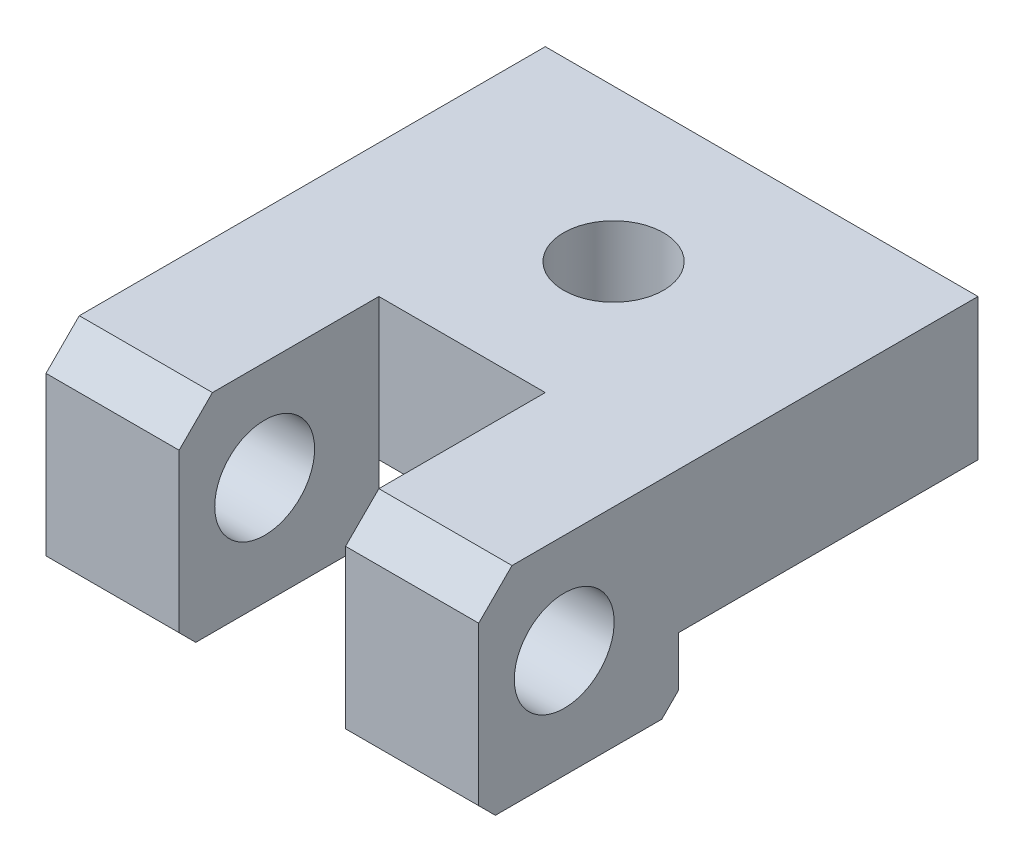
ISO-10303-21;
HEADER;
FILE_DESCRIPTION(('STEP AP214'),'2;1');
FILE_NAME('part.step','',(''),(''),'','','');
FILE_SCHEMA(('AUTOMOTIVE_DESIGN { 1 0 10303 214 1 1 1 1 }'));
ENDSEC;
DATA;
#1=APPLICATION_CONTEXT('core data for automotive mechanical design processes');
#2=APPLICATION_PROTOCOL_DEFINITION('international standard','automotive_design',2000,#1);
#3=PRODUCT_CONTEXT('',#1,'mechanical');
#4=PRODUCT('Part','Part','',(#3));
#5=PRODUCT_RELATED_PRODUCT_CATEGORY('part','',(#4));
#6=PRODUCT_DEFINITION_FORMATION('','',#4);
#7=PRODUCT_DEFINITION_CONTEXT('part definition',#1,'design');
#8=PRODUCT_DEFINITION('design','',#6,#7);
#9=PRODUCT_DEFINITION_SHAPE('','',#8);
#10=(LENGTH_UNIT() NAMED_UNIT(*) SI_UNIT(.MILLI.,.METRE.));
#11=(NAMED_UNIT(*) PLANE_ANGLE_UNIT() SI_UNIT($,.RADIAN.));
#12=(NAMED_UNIT(*) SI_UNIT($,.STERADIAN.) SOLID_ANGLE_UNIT());
#13=UNCERTAINTY_MEASURE_WITH_UNIT(LENGTH_MEASURE(1.E-05),#10,'distance_accuracy_value','');
#14=(GEOMETRIC_REPRESENTATION_CONTEXT(3) GLOBAL_UNCERTAINTY_ASSIGNED_CONTEXT((#13)) GLOBAL_UNIT_ASSIGNED_CONTEXT((#10,
#11,#12)) REPRESENTATION_CONTEXT('',''));
#15=CARTESIAN_POINT('',(0.,0.,0.));
#16=DIRECTION('',(0.,0.,1.));
#17=DIRECTION('',(1.,0.,0.));
#18=AXIS2_PLACEMENT_3D('',#15,#16,#17);
#19=CARTESIAN_POINT('',(15.,-7.5,20.));
#20=DIRECTION('',(0.,0.,1.));
#21=DIRECTION('',(1.,0.,0.));
#22=AXIS2_PLACEMENT_3D('',#19,#20,#21);
#23=PLANE('',#22);
#24=DIRECTION('',(0.,-1.,0.));
#25=VECTOR('',#24,1.);
#26=CARTESIAN_POINT('',(13.,-7.5,20.));
#27=LINE('',#26,#25);
#28=CARTESIAN_POINT('',(13.,4.,20.));
#29=VERTEX_POINT('',#28);
#30=CARTESIAN_POINT('',(13.,-5.5,20.));
#31=VERTEX_POINT('',#30);
#32=EDGE_CURVE('E166',#29,#31,#27,.T.);
#33=ORIENTED_EDGE('',*,*,#32,.F.);
#34=DIRECTION('',(-1.,0.,0.));
#35=VECTOR('',#34,1.);
#36=CARTESIAN_POINT('',(5.,4.,20.));
#37=LINE('',#36,#35);
#38=CARTESIAN_POINT('',(5.,3.99999999999999,20.));
#39=VERTEX_POINT('',#38);
#40=EDGE_CURVE('E180',#29,#39,#37,.T.);
#41=ORIENTED_EDGE('',*,*,#40,.T.);
#42=DIRECTION('',(0.,1.,0.));
#43=VECTOR('',#42,1.);
#44=CARTESIAN_POINT('',(5.,-7.5,20.));
#45=LINE('',#44,#43);
#46=CARTESIAN_POINT('',(5.,-5.5,20.));
#47=VERTEX_POINT('',#46);
#48=EDGE_CURVE('E202',#47,#39,#45,.T.);
#49=ORIENTED_EDGE('',*,*,#48,.F.);
#50=DIRECTION('',(1.,0.,0.));
#51=VECTOR('',#50,1.);
#52=CARTESIAN_POINT('',(15.,-5.5,20.));
#53=LINE('',#52,#51);
#54=EDGE_CURVE('E182',#47,#31,#53,.T.);
#55=ORIENTED_EDGE('',*,*,#54,.T.);
#56=EDGE_LOOP('',(#33,#41,#49,#55));
#57=FACE_BOUND('',#56,.T.);
#58=ADVANCED_FACE('F32',(#57),#23,.T.);
#59=CARTESIAN_POINT('',(-15.,6.,20.));
#60=DIRECTION('',(0.,-1.,0.));
#61=DIRECTION('',(0.,0.,-1.));
#62=AXIS2_PLACEMENT_3D('',#59,#60,#61);
#63=PLANE('',#62);
#64=CARTESIAN_POINT('',(0.231400022130722,6.,-0.869933178962582));
#65=DIRECTION('',(0.,1.,0.));
#66=DIRECTION('',(0.,0.,1.));
#67=AXIS2_PLACEMENT_3D('',#64,#65,#66);
#68=CIRCLE('',#67,3.00000000000002);
#69=CARTESIAN_POINT('',(0.231400022130722,6.,2.13006682103744));
#70=VERTEX_POINT('',#69);
#71=EDGE_CURVE('E237',#70,#70,#68,.T.);
#72=ORIENTED_EDGE('',*,*,#71,.F.);
#73=EDGE_LOOP('',(#72));
#74=FACE_BOUND('',#73,.T.);
#75=DIRECTION('',(1.,0.,0.));
#76=VECTOR('',#75,1.);
#77=CARTESIAN_POINT('',(15.,6.,18.));
#78=LINE('',#77,#76);
#79=CARTESIAN_POINT('',(5.,6.,18.));
#80=VERTEX_POINT('',#79);
#81=CARTESIAN_POINT('',(13.,6.,18.));
#82=VERTEX_POINT('',#81);
#83=EDGE_CURVE('E175',#80,#82,#78,.T.);
#84=ORIENTED_EDGE('',*,*,#83,.T.);
#85=DIRECTION('',(0.,0.,1.));
#86=VECTOR('',#85,1.);
#87=CARTESIAN_POINT('',(13.,6.,-13.3998616387441));
#88=LINE('',#87,#86);
#89=CARTESIAN_POINT('',(13.,6.,-10.));
#90=VERTEX_POINT('',#89);
#91=EDGE_CURVE('E286',#90,#82,#88,.T.);
#92=ORIENTED_EDGE('',*,*,#91,.F.);
#93=DIRECTION('',(1.,0.,0.));
#94=VECTOR('',#93,1.);
#95=CARTESIAN_POINT('',(-15.,6.,-10.));
#96=LINE('',#95,#94);
#97=CARTESIAN_POINT('',(-13.,6.,-10.));
#98=VERTEX_POINT('',#97);
#99=EDGE_CURVE('E212',#98,#90,#96,.T.);
#100=ORIENTED_EDGE('',*,*,#99,.F.);
#101=DIRECTION('',(0.,0.,-1.));
#102=VECTOR('',#101,1.);
#103=CARTESIAN_POINT('',(-13.,6.,-13.3998616387441));
#104=LINE('',#103,#102);
#105=CARTESIAN_POINT('',(-13.,6.,18.));
#106=VERTEX_POINT('',#105);
#107=EDGE_CURVE('E267',#106,#98,#104,.T.);
#108=ORIENTED_EDGE('',*,*,#107,.F.);
#109=DIRECTION('',(1.,0.,0.));
#110=VECTOR('',#109,1.);
#111=CARTESIAN_POINT('',(-5.00000000000001,6.,18.));
#112=LINE('',#111,#110);
#113=CARTESIAN_POINT('',(-5.00000000000001,6.,18.));
#114=VERTEX_POINT('',#113);
#115=EDGE_CURVE('E178',#106,#114,#112,.T.);
#116=ORIENTED_EDGE('',*,*,#115,.T.);
#117=DIRECTION('',(0.,0.,-1.));
#118=VECTOR('',#117,1.);
#119=CARTESIAN_POINT('',(-5.00000000000001,6.,28.1632423609155));
#120=LINE('',#119,#118);
#121=CARTESIAN_POINT('',(-5.00000000000002,6.,8.));
#122=VERTEX_POINT('',#121);
#123=EDGE_CURVE('E228',#114,#122,#120,.T.);
#124=ORIENTED_EDGE('',*,*,#123,.T.);
#125=DIRECTION('',(1.,0.,0.));
#126=VECTOR('',#125,1.);
#127=CARTESIAN_POINT('',(-5.00000000000002,6.,8.));
#128=LINE('',#127,#126);
#129=CARTESIAN_POINT('',(5.,6.,8.));
#130=VERTEX_POINT('',#129);
#131=EDGE_CURVE('E225',#122,#130,#128,.T.);
#132=ORIENTED_EDGE('',*,*,#131,.T.);
#133=DIRECTION('',(0.,0.,1.));
#134=VECTOR('',#133,1.);
#135=CARTESIAN_POINT('',(5.,6.,28.1632423609155));
#136=LINE('',#135,#134);
#137=EDGE_CURVE('E230',#130,#80,#136,.T.);
#138=ORIENTED_EDGE('',*,*,#137,.T.);
#139=EDGE_LOOP('',(#84,#92,#100,#108,#116,#124,#132,#138));
#140=FACE_BOUND('',#139,.T.);
#141=ADVANCED_FACE('F333',(#74,#140),#63,.F.);
#142=DIRECTION('',(0.,1.,0.));
#143=VECTOR('',#142,1.);
#144=CARTESIAN_POINT('',(-13.,-7.5,20.));
#145=LINE('',#144,#143);
#146=CARTESIAN_POINT('',(-13.,-5.5,20.));
#147=VERTEX_POINT('',#146);
#148=CARTESIAN_POINT('',(-13.,4.,20.));
#149=VERTEX_POINT('',#148);
#150=EDGE_CURVE('E265',#147,#149,#145,.T.);
#151=ORIENTED_EDGE('',*,*,#150,.F.);
#152=DIRECTION('',(1.,0.,0.));
#153=VECTOR('',#152,1.);
#154=CARTESIAN_POINT('',(-5.00000000000001,-5.5,20.));
#155=LINE('',#154,#153);
#156=CARTESIAN_POINT('',(-5.00000000000002,-5.5,20.));
#157=VERTEX_POINT('',#156);
#158=EDGE_CURVE('E173',#147,#157,#155,.T.);
#159=ORIENTED_EDGE('',*,*,#158,.T.);
#160=DIRECTION('',(0.,-1.,0.));
#161=VECTOR('',#160,1.);
#162=CARTESIAN_POINT('',(-5.00000000000002,-7.5,20.));
#163=LINE('',#162,#161);
#164=CARTESIAN_POINT('',(-5.00000000000002,3.99999999999999,20.));
#165=VERTEX_POINT('',#164);
#166=EDGE_CURVE('E215',#165,#157,#163,.T.);
#167=ORIENTED_EDGE('',*,*,#166,.F.);
#168=DIRECTION('',(-1.,0.,0.));
#169=VECTOR('',#168,1.);
#170=CARTESIAN_POINT('',(-15.,4.,20.));
#171=LINE('',#170,#169);
#172=EDGE_CURVE('E168',#165,#149,#171,.T.);
#173=ORIENTED_EDGE('',*,*,#172,.T.);
#174=EDGE_LOOP('',(#151,#159,#167,#173));
#175=FACE_BOUND('',#174,.T.);
#176=ADVANCED_FACE('F380',(#175),#23,.T.);
#177=CARTESIAN_POINT('',(5.,6.,28.1632423609155));
#178=DIRECTION('',(1.,0.,0.));
#179=DIRECTION('',(0.,0.,-1.));
#180=AXIS2_PLACEMENT_3D('',#177,#178,#179);
#181=PLANE('',#180);
#182=CARTESIAN_POINT('',(5.,0.,14.861357689432));
#183=DIRECTION('',(1.,0.,0.));
#184=DIRECTION('',(0.,0.,-1.));
#185=AXIS2_PLACEMENT_3D('',#182,#183,#184);
#186=CIRCLE('',#185,3.);
#187=CARTESIAN_POINT('',(5.,0.,11.861357689432));
#188=VERTEX_POINT('',#187);
#189=EDGE_CURVE('E211',#188,#188,#186,.T.);
#190=ORIENTED_EDGE('',*,*,#189,.T.);
#191=EDGE_LOOP('',(#190));
#192=FACE_BOUND('',#191,.T.);
#193=DIRECTION('',(0.,0.707106781186546,-0.707106781186549));
#194=VECTOR('',#193,1.);
#195=CARTESIAN_POINT('',(5.,-5.5,8.));
#196=LINE('',#195,#194);
#197=CARTESIAN_POINT('',(5.,-5.5,8.));
#198=VERTEX_POINT('',#197);
#199=CARTESIAN_POINT('',(5.,-6.5,9.00000000000001));
#200=VERTEX_POINT('',#199);
#201=EDGE_CURVE('E184',#198,#200,#196,.F.);
#202=ORIENTED_EDGE('',*,*,#201,.T.);
#203=DIRECTION('',(0.,0.,1.));
#204=VECTOR('',#203,1.);
#205=CARTESIAN_POINT('',(5.,-6.5,28.1632423609155));
#206=LINE('',#205,#204);
#207=CARTESIAN_POINT('',(5.,-6.5,19.));
#208=VERTEX_POINT('',#207);
#209=EDGE_CURVE('E296',#200,#208,#206,.T.);
#210=ORIENTED_EDGE('',*,*,#209,.T.);
#211=DIRECTION('',(0.,0.707106781186546,0.707106781186549));
#212=VECTOR('',#211,1.);
#213=CARTESIAN_POINT('',(5.,-5.5,20.));
#214=LINE('',#213,#212);
#215=EDGE_CURVE('E160',#208,#47,#214,.T.);
#216=ORIENTED_EDGE('',*,*,#215,.T.);
#217=ORIENTED_EDGE('',*,*,#48,.T.);
#218=DIRECTION('',(0.,0.707106781186546,-0.707106781186549));
#219=VECTOR('',#218,1.);
#220=CARTESIAN_POINT('',(5.,4.,20.));
#221=LINE('',#220,#219);
#222=EDGE_CURVE('E187',#39,#80,#221,.T.);
#223=ORIENTED_EDGE('',*,*,#222,.T.);
#224=ORIENTED_EDGE('',*,*,#137,.F.);
#225=DIRECTION('',(0.,-1.,0.));
#226=VECTOR('',#225,1.);
#227=CARTESIAN_POINT('',(5.,6.,8.));
#228=LINE('',#227,#226);
#229=CARTESIAN_POINT('',(5.,-2.5,8.));
#230=VERTEX_POINT('',#229);
#231=EDGE_CURVE('E218',#130,#230,#228,.T.);
#232=ORIENTED_EDGE('',*,*,#231,.T.);
#233=DIRECTION('',(0.,-1.,0.));
#234=VECTOR('',#233,1.);
#235=CARTESIAN_POINT('',(5.,6.,8.));
#236=LINE('',#235,#234);
#237=EDGE_CURVE('E206',#230,#198,#236,.T.);
#238=ORIENTED_EDGE('',*,*,#237,.T.);
#239=EDGE_LOOP('',(#202,#210,#216,#217,#223,#224,#232,#238));
#240=FACE_BOUND('',#239,.T.);
#241=ADVANCED_FACE('F344',(#192,#240),#181,.F.);
#242=CARTESIAN_POINT('',(-5.00000000000002,6.,8.));
#243=DIRECTION('',(0.,0.,-1.));
#244=DIRECTION('',(-1.,0.,0.));
#245=AXIS2_PLACEMENT_3D('',#242,#243,#244);
#246=PLANE('',#245);
#247=DIRECTION('',(0.,-1.,0.));
#248=VECTOR('',#247,1.);
#249=CARTESIAN_POINT('',(-5.00000000000002,6.,8.));
#250=LINE('',#249,#248);
#251=CARTESIAN_POINT('',(-5.00000000000002,-2.5,8.));
#252=VERTEX_POINT('',#251);
#253=EDGE_CURVE('E219',#122,#252,#250,.T.);
#254=ORIENTED_EDGE('',*,*,#253,.T.);
#255=DIRECTION('',(-1.,0.,0.));
#256=VECTOR('',#255,1.);
#257=CARTESIAN_POINT('',(-15.,-2.5,8.));
#258=LINE('',#257,#256);
#259=EDGE_CURVE('E243',#230,#252,#258,.T.);
#260=ORIENTED_EDGE('',*,*,#259,.F.);
#261=ORIENTED_EDGE('',*,*,#231,.F.);
#262=ORIENTED_EDGE('',*,*,#131,.F.);
#263=EDGE_LOOP('',(#254,#260,#261,#262));
#264=FACE_BOUND('',#263,.T.);
#265=ADVANCED_FACE('F392',(#264),#246,.F.);
#266=CARTESIAN_POINT('',(-5.00000000000001,6.,28.1632423609155));
#267=DIRECTION('',(-1.,0.,0.));
#268=DIRECTION('',(0.,0.,1.));
#269=AXIS2_PLACEMENT_3D('',#266,#267,#268);
#270=PLANE('',#269);
#271=CARTESIAN_POINT('',(-5.00000000000002,0.,14.861357689432));
#272=DIRECTION('',(-1.,0.,0.));
#273=DIRECTION('',(0.,0.,1.));
#274=AXIS2_PLACEMENT_3D('',#271,#272,#273);
#275=CIRCLE('',#274,3.);
#276=CARTESIAN_POINT('',(-5.00000000000001,0.,17.861357689432));
#277=VERTEX_POINT('',#276);
#278=EDGE_CURVE('E208',#277,#277,#275,.T.);
#279=ORIENTED_EDGE('',*,*,#278,.T.);
#280=EDGE_LOOP('',(#279));
#281=FACE_BOUND('',#280,.T.);
#282=DIRECTION('',(0.,-0.707106781186546,-0.707106781186549));
#283=VECTOR('',#282,1.);
#284=CARTESIAN_POINT('',(-5.00000000000002,-5.5,20.));
#285=LINE('',#284,#283);
#286=CARTESIAN_POINT('',(-5.00000000000002,-6.5,19.));
#287=VERTEX_POINT('',#286);
#288=EDGE_CURVE('E196',#157,#287,#285,.T.);
#289=ORIENTED_EDGE('',*,*,#288,.T.);
#290=DIRECTION('',(0.,0.,-1.));
#291=VECTOR('',#290,1.);
#292=CARTESIAN_POINT('',(-5.00000000000001,-6.5,28.1632423609155));
#293=LINE('',#292,#291);
#294=CARTESIAN_POINT('',(-5.00000000000002,-6.5,9.00000000000001));
#295=VERTEX_POINT('',#294);
#296=EDGE_CURVE('E288',#287,#295,#293,.T.);
#297=ORIENTED_EDGE('',*,*,#296,.T.);
#298=DIRECTION('',(0.,-0.707106781186546,0.707106781186549));
#299=VECTOR('',#298,1.);
#300=CARTESIAN_POINT('',(-5.00000000000002,-5.5,8.));
#301=LINE('',#300,#299);
#302=CARTESIAN_POINT('',(-5.00000000000002,-5.49999999999999,8.));
#303=VERTEX_POINT('',#302);
#304=EDGE_CURVE('E192',#295,#303,#301,.F.);
#305=ORIENTED_EDGE('',*,*,#304,.T.);
#306=EDGE_CURVE('E222',#252,#303,#250,.T.);
#307=ORIENTED_EDGE('',*,*,#306,.F.);
#308=ORIENTED_EDGE('',*,*,#253,.F.);
#309=ORIENTED_EDGE('',*,*,#123,.F.);
#310=DIRECTION('',(0.,-0.707106781186546,0.707106781186549));
#311=VECTOR('',#310,1.);
#312=CARTESIAN_POINT('',(-5.00000000000002,3.99999999999999,20.));
#313=LINE('',#312,#311);
#314=EDGE_CURVE('E194',#114,#165,#313,.T.);
#315=ORIENTED_EDGE('',*,*,#314,.T.);
#316=ORIENTED_EDGE('',*,*,#166,.T.);
#317=EDGE_LOOP('',(#289,#297,#305,#307,#308,#309,#315,#316));
#318=FACE_BOUND('',#317,.T.);
#319=ADVANCED_FACE('F389',(#281,#318),#270,.F.);
#320=CARTESIAN_POINT('',(-15.,0.,14.861357689432));
#321=DIRECTION('',(1.,0.,0.));
#322=DIRECTION('',(0.,1.,0.));
#323=AXIS2_PLACEMENT_3D('',#320,#321,#322);
#324=CYLINDRICAL_SURFACE('',#323,3.);
#325=CARTESIAN_POINT('',(-13.,0.,14.861357689432));
#326=DIRECTION('',(1.,0.,0.));
#327=DIRECTION('',(0.,0.,-1.));
#328=AXIS2_PLACEMENT_3D('',#325,#326,#327);
#329=CIRCLE('',#328,3.);
#330=CARTESIAN_POINT('',(-13.,0.,11.861357689432));
#331=VERTEX_POINT('',#330);
#332=EDGE_CURVE('E248',#331,#331,#329,.F.);
#333=ORIENTED_EDGE('',*,*,#332,.T.);
#334=EDGE_LOOP('',(#333));
#335=FACE_BOUND('',#334,.T.);
#336=ORIENTED_EDGE('',*,*,#278,.F.);
#337=EDGE_LOOP('',(#336));
#338=FACE_BOUND('',#337,.T.);
#339=ADVANCED_FACE('F399',(#335,#338),#324,.F.);
#340=CARTESIAN_POINT('',(13.,0.,14.861357689432));
#341=DIRECTION('',(-1.,0.,0.));
#342=DIRECTION('',(0.,0.,1.));
#343=AXIS2_PLACEMENT_3D('',#340,#341,#342);
#344=CIRCLE('',#343,3.);
#345=CARTESIAN_POINT('',(13.,0.,17.861357689432));
#346=VERTEX_POINT('',#345);
#347=EDGE_CURVE('E269',#346,#346,#344,.F.);
#348=ORIENTED_EDGE('',*,*,#347,.T.);
#349=EDGE_LOOP('',(#348));
#350=FACE_BOUND('',#349,.T.);
#351=ORIENTED_EDGE('',*,*,#189,.F.);
#352=EDGE_LOOP('',(#351));
#353=FACE_BOUND('',#352,.T.);
#354=ADVANCED_FACE('F324',(#350,#353),#324,.F.);
#355=CARTESIAN_POINT('',(15.,-7.5,-10.));
#356=DIRECTION('',(0.,0.,1.));
#357=DIRECTION('',(1.,0.,0.));
#358=AXIS2_PLACEMENT_3D('',#355,#356,#357);
#359=PLANE('',#358);
#360=CARTESIAN_POINT('',(-8.00000010418048,1.75000000292737,-10.));
#361=DIRECTION('',(0.,0.,-1.));
#362=DIRECTION('',(-1.,0.,0.));
#363=AXIS2_PLACEMENT_3D('',#360,#361,#362);
#364=CIRCLE('',#363,2.00000000361865);
#365=CARTESIAN_POINT('',(-10.0000001077991,1.75000000292737,-10.));
#366=VERTEX_POINT('',#365);
#367=EDGE_CURVE('E305',#366,#366,#364,.T.);
#368=ORIENTED_EDGE('',*,*,#367,.F.);
#369=EDGE_LOOP('',(#368));
#370=FACE_BOUND('',#369,.T.);
#371=CARTESIAN_POINT('',(7.99999989581919,1.74849822384953,-10.));
#372=DIRECTION('',(0.,0.,-1.));
#373=DIRECTION('',(-1.,0.,0.));
#374=AXIS2_PLACEMENT_3D('',#371,#372,#373);
#375=CIRCLE('',#374,2.00000000361865);
#376=CARTESIAN_POINT('',(5.99999989220055,1.74849822384953,-10.));
#377=VERTEX_POINT('',#376);
#378=EDGE_CURVE('E299',#377,#377,#375,.T.);
#379=ORIENTED_EDGE('',*,*,#378,.F.);
#380=EDGE_LOOP('',(#379));
#381=FACE_BOUND('',#380,.T.);
#382=ORIENTED_EDGE('',*,*,#99,.T.);
#383=DIRECTION('',(0.,-1.,0.));
#384=VECTOR('',#383,1.);
#385=CARTESIAN_POINT('',(13.,-7.5,-10.));
#386=LINE('',#385,#384);
#387=CARTESIAN_POINT('',(13.,-2.5,-10.));
#388=VERTEX_POINT('',#387);
#389=EDGE_CURVE('E272',#90,#388,#386,.T.);
#390=ORIENTED_EDGE('',*,*,#389,.T.);
#391=DIRECTION('',(1.,0.,0.));
#392=VECTOR('',#391,1.);
#393=CARTESIAN_POINT('',(-15.,-2.5,-10.));
#394=LINE('',#393,#392);
#395=CARTESIAN_POINT('',(-13.,-2.5,-10.));
#396=VERTEX_POINT('',#395);
#397=EDGE_CURVE('E245',#396,#388,#394,.T.);
#398=ORIENTED_EDGE('',*,*,#397,.F.);
#399=DIRECTION('',(0.,1.,0.));
#400=VECTOR('',#399,1.);
#401=CARTESIAN_POINT('',(-13.,-7.5,-10.));
#402=LINE('',#401,#400);
#403=EDGE_CURVE('E251',#396,#98,#402,.T.);
#404=ORIENTED_EDGE('',*,*,#403,.T.);
#405=EDGE_LOOP('',(#382,#390,#398,#404));
#406=FACE_BOUND('',#405,.T.);
#407=ADVANCED_FACE('F320',(#370,#381,#406),#359,.F.);
#408=CARTESIAN_POINT('',(0.231400022130722,-7.5,-0.869933178962582));
#409=DIRECTION('',(0.,1.,0.));
#410=DIRECTION('',(0.,0.,1.));
#411=AXIS2_PLACEMENT_3D('',#408,#409,#410);
#412=CYLINDRICAL_SURFACE('',#411,3.00000000000002);
#413=CARTESIAN_POINT('',(0.231400022130722,-2.5,-0.869933178962582));
#414=DIRECTION('',(0.,1.,0.));
#415=DIRECTION('',(0.,0.,1.));
#416=AXIS2_PLACEMENT_3D('',#413,#414,#415);
#417=CIRCLE('',#416,3.00000000000002);
#418=CARTESIAN_POINT('',(0.231400022130722,-2.5,2.13006682103744));
#419=VERTEX_POINT('',#418);
#420=EDGE_CURVE('E203',#419,#419,#417,.F.);
#421=ORIENTED_EDGE('',*,*,#420,.T.);
#422=EDGE_LOOP('',(#421));
#423=FACE_BOUND('',#422,.T.);
#424=ORIENTED_EDGE('',*,*,#71,.T.);
#425=EDGE_LOOP('',(#424));
#426=FACE_BOUND('',#425,.T.);
#427=ADVANCED_FACE('F323',(#423,#426),#412,.F.);
#428=CARTESIAN_POINT('',(-15.,-2.5,8.));
#429=DIRECTION('',(0.,0.,1.));
#430=DIRECTION('',(1.,0.,0.));
#431=AXIS2_PLACEMENT_3D('',#428,#429,#430);
#432=PLANE('',#431);
#433=CARTESIAN_POINT('',(13.,-2.5,8.));
#434=VERTEX_POINT('',#433);
#435=EDGE_CURVE('E207',#434,#230,#258,.T.);
#436=ORIENTED_EDGE('',*,*,#435,.F.);
#437=DIRECTION('',(0.,-1.,0.));
#438=VECTOR('',#437,1.);
#439=CARTESIAN_POINT('',(13.,-2.5,8.));
#440=LINE('',#439,#438);
#441=CARTESIAN_POINT('',(13.,-5.5,8.));
#442=VERTEX_POINT('',#441);
#443=EDGE_CURVE('E278',#434,#442,#440,.T.);
#444=ORIENTED_EDGE('',*,*,#443,.T.);
#445=DIRECTION('',(-1.,0.,0.));
#446=VECTOR('',#445,1.);
#447=CARTESIAN_POINT('',(-15.,-5.5,8.));
#448=LINE('',#447,#446);
#449=EDGE_CURVE('E190',#442,#198,#448,.T.);
#450=ORIENTED_EDGE('',*,*,#449,.T.);
#451=ORIENTED_EDGE('',*,*,#237,.F.);
#452=EDGE_LOOP('',(#436,#444,#450,#451));
#453=FACE_BOUND('',#452,.T.);
#454=ADVANCED_FACE('F352',(#453),#432,.F.);
#455=DIRECTION('',(-1.,0.,0.));
#456=VECTOR('',#455,1.);
#457=CARTESIAN_POINT('',(-15.,-5.5,8.));
#458=LINE('',#457,#456);
#459=CARTESIAN_POINT('',(-13.,-5.5,8.));
#460=VERTEX_POINT('',#459);
#461=EDGE_CURVE('E199',#303,#460,#458,.T.);
#462=ORIENTED_EDGE('',*,*,#461,.T.);
#463=DIRECTION('',(0.,1.,0.));
#464=VECTOR('',#463,1.);
#465=CARTESIAN_POINT('',(-13.,-2.5,8.));
#466=LINE('',#465,#464);
#467=CARTESIAN_POINT('',(-13.,-2.5,8.));
#468=VERTEX_POINT('',#467);
#469=EDGE_CURVE('E257',#460,#468,#466,.T.);
#470=ORIENTED_EDGE('',*,*,#469,.T.);
#471=EDGE_CURVE('E244',#252,#468,#258,.T.);
#472=ORIENTED_EDGE('',*,*,#471,.F.);
#473=ORIENTED_EDGE('',*,*,#306,.T.);
#474=EDGE_LOOP('',(#462,#470,#472,#473));
#475=FACE_BOUND('',#474,.T.);
#476=ADVANCED_FACE('F366',(#475),#432,.F.);
#477=CARTESIAN_POINT('',(-15.,-2.5,8.));
#478=DIRECTION('',(0.,1.,0.));
#479=DIRECTION('',(0.,0.,1.));
#480=AXIS2_PLACEMENT_3D('',#477,#478,#479);
#481=PLANE('',#480);
#482=ORIENTED_EDGE('',*,*,#397,.T.);
#483=DIRECTION('',(0.,0.,1.));
#484=VECTOR('',#483,1.);
#485=CARTESIAN_POINT('',(13.,-2.5,8.00000000000001));
#486=LINE('',#485,#484);
#487=EDGE_CURVE('E275',#388,#434,#486,.T.);
#488=ORIENTED_EDGE('',*,*,#487,.T.);
#489=ORIENTED_EDGE('',*,*,#435,.T.);
#490=ORIENTED_EDGE('',*,*,#259,.T.);
#491=ORIENTED_EDGE('',*,*,#471,.T.);
#492=DIRECTION('',(0.,0.,-1.));
#493=VECTOR('',#492,1.);
#494=CARTESIAN_POINT('',(-13.,-2.5,8.));
#495=LINE('',#494,#493);
#496=EDGE_CURVE('E254',#468,#396,#495,.T.);
#497=ORIENTED_EDGE('',*,*,#496,.T.);
#498=EDGE_LOOP('',(#482,#488,#489,#490,#491,#497));
#499=FACE_BOUND('',#498,.T.);
#500=ORIENTED_EDGE('',*,*,#420,.F.);
#501=EDGE_LOOP('',(#500));
#502=FACE_BOUND('',#501,.T.);
#503=ADVANCED_FACE('F357',(#499,#502),#481,.F.);
#504=CARTESIAN_POINT('',(-15.,-5.5,8.));
#505=DIRECTION('',(0.,0.707106781186549,0.707106781186546));
#506=DIRECTION('',(0.,-0.707106781186546,0.707106781186549));
#507=AXIS2_PLACEMENT_3D('',#504,#505,#506);
#508=PLANE('',#507);
#509=DIRECTION('',(-1.,0.,0.));
#510=VECTOR('',#509,1.);
#511=CARTESIAN_POINT('',(-15.,-6.5,9.00000000000001));
#512=LINE('',#511,#510);
#513=CARTESIAN_POINT('',(-13.,-6.5,9.00000000000001));
#514=VERTEX_POINT('',#513);
#515=EDGE_CURVE('E291',#514,#295,#512,.F.);
#516=ORIENTED_EDGE('',*,*,#515,.F.);
#517=DIRECTION('',(0.,0.707106781186546,-0.707106781186549));
#518=VECTOR('',#517,1.);
#519=CARTESIAN_POINT('',(-13.,-5.5,8.));
#520=LINE('',#519,#518);
#521=EDGE_CURVE('E260',#460,#514,#520,.F.);
#522=ORIENTED_EDGE('',*,*,#521,.F.);
#523=ORIENTED_EDGE('',*,*,#461,.F.);
#524=ORIENTED_EDGE('',*,*,#304,.F.);
#525=EDGE_LOOP('',(#516,#522,#523,#524));
#526=FACE_BOUND('',#525,.T.);
#527=ADVANCED_FACE('F372',(#526),#508,.F.);
#528=CARTESIAN_POINT('',(-15.,-5.5,8.));
#529=DIRECTION('',(0.,0.707106781186549,0.707106781186546));
#530=DIRECTION('',(0.,-0.707106781186546,0.707106781186549));
#531=AXIS2_PLACEMENT_3D('',#528,#529,#530);
#532=PLANE('',#531);
#533=DIRECTION('',(-1.,0.,0.));
#534=VECTOR('',#533,1.);
#535=CARTESIAN_POINT('',(-15.,-6.5,9.00000000000001));
#536=LINE('',#535,#534);
#537=CARTESIAN_POINT('',(13.,-6.5,9.00000000000001));
#538=VERTEX_POINT('',#537);
#539=EDGE_CURVE('E55',#200,#538,#536,.F.);
#540=ORIENTED_EDGE('',*,*,#539,.F.);
#541=ORIENTED_EDGE('',*,*,#201,.F.);
#542=ORIENTED_EDGE('',*,*,#449,.F.);
#543=DIRECTION('',(0.,-0.707106781186546,0.707106781186549));
#544=VECTOR('',#543,1.);
#545=CARTESIAN_POINT('',(13.,-5.5,8.00000000000001));
#546=LINE('',#545,#544);
#547=EDGE_CURVE('E281',#538,#442,#546,.F.);
#548=ORIENTED_EDGE('',*,*,#547,.F.);
#549=EDGE_LOOP('',(#540,#541,#542,#548));
#550=FACE_BOUND('',#549,.T.);
#551=ADVANCED_FACE('F348',(#550),#532,.F.);
#552=CARTESIAN_POINT('',(15.,4.,20.));
#553=DIRECTION('',(0.,0.707106781186549,0.707106781186546));
#554=DIRECTION('',(0.,-0.707106781186546,0.707106781186549));
#555=AXIS2_PLACEMENT_3D('',#552,#553,#554);
#556=PLANE('',#555);
#557=DIRECTION('',(0.,-0.707106781186546,0.707106781186549));
#558=VECTOR('',#557,1.);
#559=CARTESIAN_POINT('',(13.,4.,20.));
#560=LINE('',#559,#558);
#561=EDGE_CURVE('E283',#82,#29,#560,.T.);
#562=ORIENTED_EDGE('',*,*,#561,.F.);
#563=ORIENTED_EDGE('',*,*,#83,.F.);
#564=ORIENTED_EDGE('',*,*,#222,.F.);
#565=ORIENTED_EDGE('',*,*,#40,.F.);
#566=EDGE_LOOP('',(#562,#563,#564,#565));
#567=FACE_BOUND('',#566,.T.);
#568=ADVANCED_FACE('F339',(#567),#556,.T.);
#569=CARTESIAN_POINT('',(15.,-5.5,20.));
#570=DIRECTION('',(0.,-0.707106781186549,0.707106781186546));
#571=DIRECTION('',(0.,-0.707106781186546,-0.707106781186549));
#572=AXIS2_PLACEMENT_3D('',#569,#570,#571);
#573=PLANE('',#572);
#574=DIRECTION('',(-1.,0.,0.));
#575=VECTOR('',#574,1.);
#576=CARTESIAN_POINT('',(15.,-6.5,19.));
#577=LINE('',#576,#575);
#578=CARTESIAN_POINT('',(13.,-6.5,19.));
#579=VERTEX_POINT('',#578);
#580=EDGE_CURVE('E149',#579,#208,#577,.T.);
#581=ORIENTED_EDGE('',*,*,#580,.F.);
#582=DIRECTION('',(0.,-0.707106781186546,-0.707106781186549));
#583=VECTOR('',#582,1.);
#584=CARTESIAN_POINT('',(13.,-5.5,20.));
#585=LINE('',#584,#583);
#586=EDGE_CURVE('E40',#31,#579,#585,.T.);
#587=ORIENTED_EDGE('',*,*,#586,.F.);
#588=ORIENTED_EDGE('',*,*,#54,.F.);
#589=ORIENTED_EDGE('',*,*,#215,.F.);
#590=EDGE_LOOP('',(#581,#587,#588,#589));
#591=FACE_BOUND('',#590,.T.);
#592=ADVANCED_FACE('F157',(#591),#573,.T.);
#593=CARTESIAN_POINT('',(15.,4.,20.));
#594=DIRECTION('',(0.,0.707106781186549,0.707106781186546));
#595=DIRECTION('',(0.,-0.707106781186546,0.707106781186549));
#596=AXIS2_PLACEMENT_3D('',#593,#594,#595);
#597=PLANE('',#596);
#598=DIRECTION('',(0.,0.707106781186546,-0.707106781186549));
#599=VECTOR('',#598,1.);
#600=CARTESIAN_POINT('',(-13.,3.99999999999999,20.));
#601=LINE('',#600,#599);
#602=EDGE_CURVE('E263',#149,#106,#601,.T.);
#603=ORIENTED_EDGE('',*,*,#602,.F.);
#604=ORIENTED_EDGE('',*,*,#172,.F.);
#605=ORIENTED_EDGE('',*,*,#314,.F.);
#606=ORIENTED_EDGE('',*,*,#115,.F.);
#607=EDGE_LOOP('',(#603,#604,#605,#606));
#608=FACE_BOUND('',#607,.T.);
#609=ADVANCED_FACE('F384',(#608),#597,.T.);
#610=CARTESIAN_POINT('',(15.,-5.5,20.));
#611=DIRECTION('',(0.,-0.707106781186549,0.707106781186546));
#612=DIRECTION('',(0.,-0.707106781186546,-0.707106781186549));
#613=AXIS2_PLACEMENT_3D('',#610,#611,#612);
#614=PLANE('',#613);
#615=DIRECTION('',(-1.,0.,0.));
#616=VECTOR('',#615,1.);
#617=CARTESIAN_POINT('',(15.,-6.5,19.));
#618=LINE('',#617,#616);
#619=CARTESIAN_POINT('',(-13.,-6.5,19.));
#620=VERTEX_POINT('',#619);
#621=EDGE_CURVE('E47',#287,#620,#618,.T.);
#622=ORIENTED_EDGE('',*,*,#621,.F.);
#623=ORIENTED_EDGE('',*,*,#288,.F.);
#624=ORIENTED_EDGE('',*,*,#158,.F.);
#625=DIRECTION('',(0.,0.707106781186546,0.707106781186549));
#626=VECTOR('',#625,1.);
#627=CARTESIAN_POINT('',(-13.,-5.5,20.));
#628=LINE('',#627,#626);
#629=EDGE_CURVE('E167',#620,#147,#628,.T.);
#630=ORIENTED_EDGE('',*,*,#629,.F.);
#631=EDGE_LOOP('',(#622,#623,#624,#630));
#632=FACE_BOUND('',#631,.T.);
#633=ADVANCED_FACE('F34',(#632),#614,.T.);
#634=CARTESIAN_POINT('',(-13.,-7.5,-13.3998616387441));
#635=DIRECTION('',(1.,0.,0.));
#636=DIRECTION('',(0.,0.,-1.));
#637=AXIS2_PLACEMENT_3D('',#634,#635,#636);
#638=PLANE('',#637);
#639=ORIENTED_EDGE('',*,*,#521,.T.);
#640=DIRECTION('',(0.,0.,1.));
#641=VECTOR('',#640,1.);
#642=CARTESIAN_POINT('',(-13.,-6.5,-13.3998616387441));
#643=LINE('',#642,#641);
#644=EDGE_CURVE('E294',#514,#620,#643,.T.);
#645=ORIENTED_EDGE('',*,*,#644,.T.);
#646=ORIENTED_EDGE('',*,*,#629,.T.);
#647=ORIENTED_EDGE('',*,*,#150,.T.);
#648=ORIENTED_EDGE('',*,*,#602,.T.);
#649=ORIENTED_EDGE('',*,*,#107,.T.);
#650=ORIENTED_EDGE('',*,*,#403,.F.);
#651=ORIENTED_EDGE('',*,*,#496,.F.);
#652=ORIENTED_EDGE('',*,*,#469,.F.);
#653=EDGE_LOOP('',(#639,#645,#646,#647,#648,#649,#650,#651,#652));
#654=FACE_BOUND('',#653,.T.);
#655=ORIENTED_EDGE('',*,*,#332,.F.);
#656=EDGE_LOOP('',(#655));
#657=FACE_BOUND('',#656,.T.);
#658=ADVANCED_FACE('F362',(#654,#657),#638,.F.);
#659=CARTESIAN_POINT('',(13.,-7.5,-13.3998616387441));
#660=DIRECTION('',(-1.,0.,0.));
#661=DIRECTION('',(0.,0.,1.));
#662=AXIS2_PLACEMENT_3D('',#659,#660,#661);
#663=PLANE('',#662);
#664=ORIENTED_EDGE('',*,*,#586,.T.);
#665=DIRECTION('',(0.,0.,-1.));
#666=VECTOR('',#665,1.);
#667=CARTESIAN_POINT('',(13.,-6.5,-13.3998616387441));
#668=LINE('',#667,#666);
#669=EDGE_CURVE('E11',#579,#538,#668,.T.);
#670=ORIENTED_EDGE('',*,*,#669,.T.);
#671=ORIENTED_EDGE('',*,*,#547,.T.);
#672=ORIENTED_EDGE('',*,*,#443,.F.);
#673=ORIENTED_EDGE('',*,*,#487,.F.);
#674=ORIENTED_EDGE('',*,*,#389,.F.);
#675=ORIENTED_EDGE('',*,*,#91,.T.);
#676=ORIENTED_EDGE('',*,*,#561,.T.);
#677=ORIENTED_EDGE('',*,*,#32,.T.);
#678=EDGE_LOOP('',(#664,#670,#671,#672,#673,#674,#675,#676,#677));
#679=FACE_BOUND('',#678,.T.);
#680=ORIENTED_EDGE('',*,*,#347,.F.);
#681=EDGE_LOOP('',(#680));
#682=FACE_BOUND('',#681,.T.);
#683=ADVANCED_FACE('F163',(#679,#682),#663,.F.);
#684=CARTESIAN_POINT('',(42.5138300589651,-6.5,-22.8093348455047));
#685=DIRECTION('',(0.,1.,0.));
#686=DIRECTION('',(0.,0.,1.));
#687=AXIS2_PLACEMENT_3D('',#684,#685,#686);
#688=PLANE('',#687);
#689=ORIENTED_EDGE('',*,*,#539,.T.);
#690=ORIENTED_EDGE('',*,*,#669,.F.);
#691=ORIENTED_EDGE('',*,*,#580,.T.);
#692=ORIENTED_EDGE('',*,*,#209,.F.);
#693=EDGE_LOOP('',(#689,#690,#691,#692));
#694=FACE_BOUND('',#693,.T.);
#695=ADVANCED_FACE('F148',(#694),#688,.F.);
#696=ORIENTED_EDGE('',*,*,#621,.T.);
#697=ORIENTED_EDGE('',*,*,#644,.F.);
#698=ORIENTED_EDGE('',*,*,#515,.T.);
#699=ORIENTED_EDGE('',*,*,#296,.F.);
#700=EDGE_LOOP('',(#696,#697,#698,#699));
#701=FACE_BOUND('',#700,.T.);
#702=ADVANCED_FACE('F497',(#701),#688,.F.);
#703=CARTESIAN_POINT('',(7.99999989581919,1.74849822384953,6.));
#704=DIRECTION('',(0.,0.,-1.));
#705=DIRECTION('',(-1.,0.,0.));
#706=AXIS2_PLACEMENT_3D('',#703,#704,#705);
#707=CYLINDRICAL_SURFACE('',#706,2.00000000361865);
#708=CARTESIAN_POINT('',(7.99999989581919,1.74849822384953,6.));
#709=DIRECTION('',(0.,0.,-1.));
#710=DIRECTION('',(-1.,0.,0.));
#711=AXIS2_PLACEMENT_3D('',#708,#709,#710);
#712=CIRCLE('',#711,2.00000000361865);
#713=CARTESIAN_POINT('',(5.99999989220055,1.74849822384953,6.));
#714=VERTEX_POINT('',#713);
#715=EDGE_CURVE('E161',#714,#714,#712,.T.);
#716=ORIENTED_EDGE('',*,*,#715,.F.);
#717=EDGE_LOOP('',(#716));
#718=FACE_BOUND('',#717,.T.);
#719=ORIENTED_EDGE('',*,*,#378,.T.);
#720=EDGE_LOOP('',(#719));
#721=FACE_BOUND('',#720,.T.);
#722=ADVANCED_FACE('F506',(#718,#721),#707,.F.);
#723=CARTESIAN_POINT('',(7.99999989581919,1.74849822384953,6.));
#724=DIRECTION('',(0.,0.,-1.));
#725=DIRECTION('',(-1.,0.,0.));
#726=AXIS2_PLACEMENT_3D('',#723,#724,#725);
#727=PLANE('',#726);
#728=ORIENTED_EDGE('',*,*,#715,.T.);
#729=EDGE_LOOP('',(#728));
#730=FACE_BOUND('',#729,.T.);
#731=ADVANCED_FACE('F316',(#730),#727,.T.);
#732=CARTESIAN_POINT('',(-8.00000010418048,1.75000000292737,6.));
#733=DIRECTION('',(0.,0.,-1.));
#734=DIRECTION('',(-1.,0.,0.));
#735=AXIS2_PLACEMENT_3D('',#732,#733,#734);
#736=CYLINDRICAL_SURFACE('',#735,2.00000000361865);
#737=CARTESIAN_POINT('',(-8.00000010418048,1.75000000292737,6.));
#738=DIRECTION('',(0.,0.,-1.));
#739=DIRECTION('',(-1.,0.,0.));
#740=AXIS2_PLACEMENT_3D('',#737,#738,#739);
#741=CIRCLE('',#740,2.00000000361865);
#742=CARTESIAN_POINT('',(-10.0000001077991,1.75000000292737,6.));
#743=VERTEX_POINT('',#742);
#744=EDGE_CURVE('E302',#743,#743,#741,.T.);
#745=ORIENTED_EDGE('',*,*,#744,.F.);
#746=EDGE_LOOP('',(#745));
#747=FACE_BOUND('',#746,.T.);
#748=ORIENTED_EDGE('',*,*,#367,.T.);
#749=EDGE_LOOP('',(#748));
#750=FACE_BOUND('',#749,.T.);
#751=ADVANCED_FACE('F313',(#747,#750),#736,.F.);
#752=CARTESIAN_POINT('',(-8.00000010418048,1.75000000292737,6.));
#753=DIRECTION('',(0.,0.,-1.));
#754=DIRECTION('',(-1.,0.,0.));
#755=AXIS2_PLACEMENT_3D('',#752,#753,#754);
#756=PLANE('',#755);
#757=ORIENTED_EDGE('',*,*,#744,.T.);
#758=EDGE_LOOP('',(#757));
#759=FACE_BOUND('',#758,.T.);
#760=ADVANCED_FACE('F311',(#759),#756,.T.);
#761=CLOSED_SHELL('',(#58,#141,#176,#241,#265,#319,#339,#354,#407,#427,#454,#476,#503,#527,#551,
#568,#592,#609,#633,#658,#683,#695,#702,#722,#731,#751,#760));
#762=MANIFOLD_SOLID_BREP('B2',#761);
#763=ADVANCED_BREP_SHAPE_REPRESENTATION('',(#18,#762),#14);
#764=SHAPE_DEFINITION_REPRESENTATION(#9,#763);
ENDSEC;
END-ISO-10303-21;
